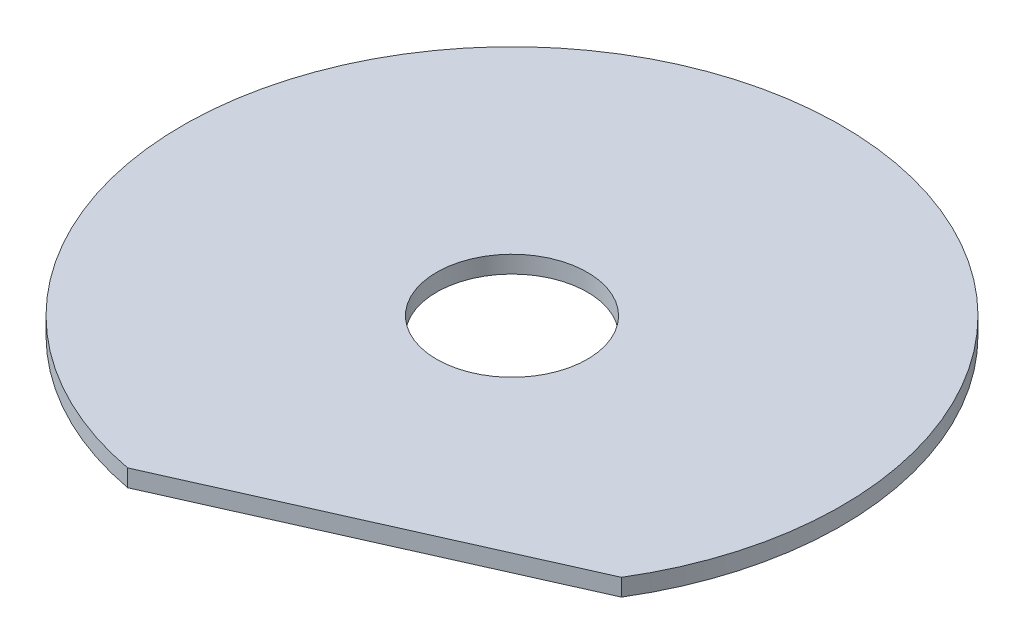
ISO-10303-21;
HEADER;
FILE_DESCRIPTION(('STEP AP214'),'2;1');
FILE_NAME('part.step','',(''),(''),'','','');
FILE_SCHEMA(('AUTOMOTIVE_DESIGN { 1 0 10303 214 1 1 1 1 }'));
ENDSEC;
DATA;
#1=APPLICATION_CONTEXT('core data for automotive mechanical design processes');
#2=APPLICATION_PROTOCOL_DEFINITION('international standard','automotive_design',2000,#1);
#3=PRODUCT_CONTEXT('',#1,'mechanical');
#4=PRODUCT('Part','Part','',(#3));
#5=PRODUCT_RELATED_PRODUCT_CATEGORY('part','',(#4));
#6=PRODUCT_DEFINITION_FORMATION('','',#4);
#7=PRODUCT_DEFINITION_CONTEXT('part definition',#1,'design');
#8=PRODUCT_DEFINITION('design','',#6,#7);
#9=PRODUCT_DEFINITION_SHAPE('','',#8);
#10=(LENGTH_UNIT() NAMED_UNIT(*) SI_UNIT(.MILLI.,.METRE.));
#11=(NAMED_UNIT(*) PLANE_ANGLE_UNIT() SI_UNIT($,.RADIAN.));
#12=(NAMED_UNIT(*) SI_UNIT($,.STERADIAN.) SOLID_ANGLE_UNIT());
#13=UNCERTAINTY_MEASURE_WITH_UNIT(LENGTH_MEASURE(1.E-05),#10,'distance_accuracy_value','');
#14=(GEOMETRIC_REPRESENTATION_CONTEXT(3) GLOBAL_UNCERTAINTY_ASSIGNED_CONTEXT((#13)) GLOBAL_UNIT_ASSIGNED_CONTEXT((#10,
#11,#12)) REPRESENTATION_CONTEXT('',''));
#15=CARTESIAN_POINT('',(0.,0.,0.));
#16=DIRECTION('',(0.,0.,1.));
#17=DIRECTION('',(1.,0.,0.));
#18=AXIS2_PLACEMENT_3D('',#15,#16,#17);
#19=CARTESIAN_POINT('',(0.,0.9906,0.));
#20=DIRECTION('',(0.,-1.,0.));
#21=DIRECTION('',(0.,0.,-1.));
#22=AXIS2_PLACEMENT_3D('',#19,#20,#21);
#23=CYLINDRICAL_SURFACE('',#22,18.9865);
#24=CARTESIAN_POINT('',(0.,0.9906,0.));
#25=DIRECTION('',(0.,1.,0.));
#26=DIRECTION('',(0.,0.,1.));
#27=AXIS2_PLACEMENT_3D('',#24,#25,#26);
#28=CIRCLE('',#27,18.9865);
#29=CARTESIAN_POINT('',(16.2019356404007,0.9906,9.89871020660332));
#30=VERTEX_POINT('',#29);
#31=CARTESIAN_POINT('',(-3.48206546027509,0.9906,18.6644689820086));
#32=VERTEX_POINT('',#31);
#33=EDGE_CURVE('E11',#30,#32,#28,.T.);
#34=ORIENTED_EDGE('',*,*,#33,.F.);
#35=DIRECTION('',(0.,1.,0.));
#36=VECTOR('',#35,1.);
#37=CARTESIAN_POINT('',(16.2019356404007,0.,9.89871020660332));
#38=LINE('',#37,#36);
#39=CARTESIAN_POINT('',(16.2019356404007,0.,9.89871020660332));
#40=VERTEX_POINT('',#39);
#41=EDGE_CURVE('E57',#40,#30,#38,.T.);
#42=ORIENTED_EDGE('',*,*,#41,.F.);
#43=CARTESIAN_POINT('',(0.,0.,0.));
#44=DIRECTION('',(0.,1.,0.));
#45=DIRECTION('',(0.,0.,1.));
#46=AXIS2_PLACEMENT_3D('',#43,#44,#45);
#47=CIRCLE('',#46,18.9865);
#48=CARTESIAN_POINT('',(-3.48206546027508,0.,18.6644689820086));
#49=VERTEX_POINT('',#48);
#50=EDGE_CURVE('E37',#40,#49,#47,.T.);
#51=ORIENTED_EDGE('',*,*,#50,.T.);
#52=DIRECTION('',(0.,1.,0.));
#53=VECTOR('',#52,1.);
#54=CARTESIAN_POINT('',(-3.48206546027509,0.,18.6644689820086));
#55=LINE('',#54,#53);
#56=EDGE_CURVE('E48',#49,#32,#55,.T.);
#57=ORIENTED_EDGE('',*,*,#56,.T.);
#58=EDGE_LOOP('',(#34,#42,#51,#57));
#59=FACE_BOUND('',#58,.T.);
#60=ADVANCED_FACE('F34',(#59),#23,.T.);
#61=CARTESIAN_POINT('',(0.,0.9906,0.));
#62=DIRECTION('',(0.,1.,0.));
#63=DIRECTION('',(0.,0.,1.));
#64=AXIS2_PLACEMENT_3D('',#61,#62,#63);
#65=PLANE('',#64);
#66=DIRECTION('',(-0.913513089947097,0.,0.406809334326668));
#67=VECTOR('',#66,1.);
#68=CARTESIAN_POINT('',(-3.48206546027509,0.9906,18.6644689820086));
#69=LINE('',#68,#67);
#70=EDGE_CURVE('E60',#30,#32,#69,.T.);
#71=ORIENTED_EDGE('',*,*,#70,.F.);
#72=ORIENTED_EDGE('',*,*,#33,.T.);
#73=EDGE_LOOP('',(#71,#72));
#74=FACE_BOUND('',#73,.T.);
#75=CARTESIAN_POINT('',(0.,0.9906,0.));
#76=DIRECTION('',(0.,1.,0.));
#77=DIRECTION('',(0.,0.,1.));
#78=AXIS2_PLACEMENT_3D('',#75,#76,#77);
#79=CIRCLE('',#78,4.3434);
#80=CARTESIAN_POINT('',(0.,0.9906,4.3434));
#81=VERTEX_POINT('',#80);
#82=EDGE_CURVE('E70',#81,#81,#79,.T.);
#83=ORIENTED_EDGE('',*,*,#82,.F.);
#84=EDGE_LOOP('',(#83));
#85=FACE_BOUND('',#84,.T.);
#86=ADVANCED_FACE('F67',(#74,#85),#65,.T.);
#87=CARTESIAN_POINT('',(0.,0.,0.));
#88=DIRECTION('',(0.,1.,0.));
#89=DIRECTION('',(0.,0.,1.));
#90=AXIS2_PLACEMENT_3D('',#87,#88,#89);
#91=PLANE('',#90);
#92=CARTESIAN_POINT('',(0.,0.,0.));
#93=DIRECTION('',(0.,1.,0.));
#94=DIRECTION('',(0.,0.,1.));
#95=AXIS2_PLACEMENT_3D('',#92,#93,#94);
#96=CIRCLE('',#95,4.3434);
#97=CARTESIAN_POINT('',(0.,0.,4.3434));
#98=VERTEX_POINT('',#97);
#99=EDGE_CURVE('E73',#98,#98,#96,.T.);
#100=ORIENTED_EDGE('',*,*,#99,.T.);
#101=EDGE_LOOP('',(#100));
#102=FACE_BOUND('',#101,.T.);
#103=ORIENTED_EDGE('',*,*,#50,.F.);
#104=DIRECTION('',(-0.913513089947097,0.,0.406809334326668));
#105=VECTOR('',#104,1.);
#106=CARTESIAN_POINT('',(-3.48206546027509,0.,18.6644689820086));
#107=LINE('',#106,#105);
#108=EDGE_CURVE('E53',#40,#49,#107,.T.);
#109=ORIENTED_EDGE('',*,*,#108,.T.);
#110=EDGE_LOOP('',(#103,#109));
#111=FACE_BOUND('',#110,.T.);
#112=ADVANCED_FACE('F80',(#102,#111),#91,.F.);
#113=CARTESIAN_POINT('',(0.,0.,0.));
#114=DIRECTION('',(0.,1.,0.));
#115=DIRECTION('',(0.,0.,1.));
#116=AXIS2_PLACEMENT_3D('',#113,#114,#115);
#117=CYLINDRICAL_SURFACE('',#116,4.3434);
#118=ORIENTED_EDGE('',*,*,#99,.F.);
#119=EDGE_LOOP('',(#118));
#120=FACE_BOUND('',#119,.T.);
#121=ORIENTED_EDGE('',*,*,#82,.T.);
#122=EDGE_LOOP('',(#121));
#123=FACE_BOUND('',#122,.T.);
#124=ADVANCED_FACE('F83',(#120,#123),#117,.F.);
#125=CARTESIAN_POINT('',(-3.48206546027509,0.,18.6644689820086));
#126=DIRECTION('',(-0.406809334326668,0.,-0.913513089947097));
#127=DIRECTION('',(-0.913513089947097,0.,0.406809334326668));
#128=AXIS2_PLACEMENT_3D('',#125,#126,#127);
#129=PLANE('',#128);
#130=ORIENTED_EDGE('',*,*,#70,.T.);
#131=ORIENTED_EDGE('',*,*,#56,.F.);
#132=ORIENTED_EDGE('',*,*,#108,.F.);
#133=ORIENTED_EDGE('',*,*,#41,.T.);
#134=EDGE_LOOP('',(#130,#131,#132,#133));
#135=FACE_BOUND('',#134,.T.);
#136=ADVANCED_FACE('F59',(#135),#129,.F.);
#137=CLOSED_SHELL('',(#60,#86,#112,#124,#136));
#138=MANIFOLD_SOLID_BREP('B2',#137);
#139=ADVANCED_BREP_SHAPE_REPRESENTATION('',(#18,#138),#14);
#140=SHAPE_DEFINITION_REPRESENTATION(#9,#139);
ENDSEC;
END-ISO-10303-21;
